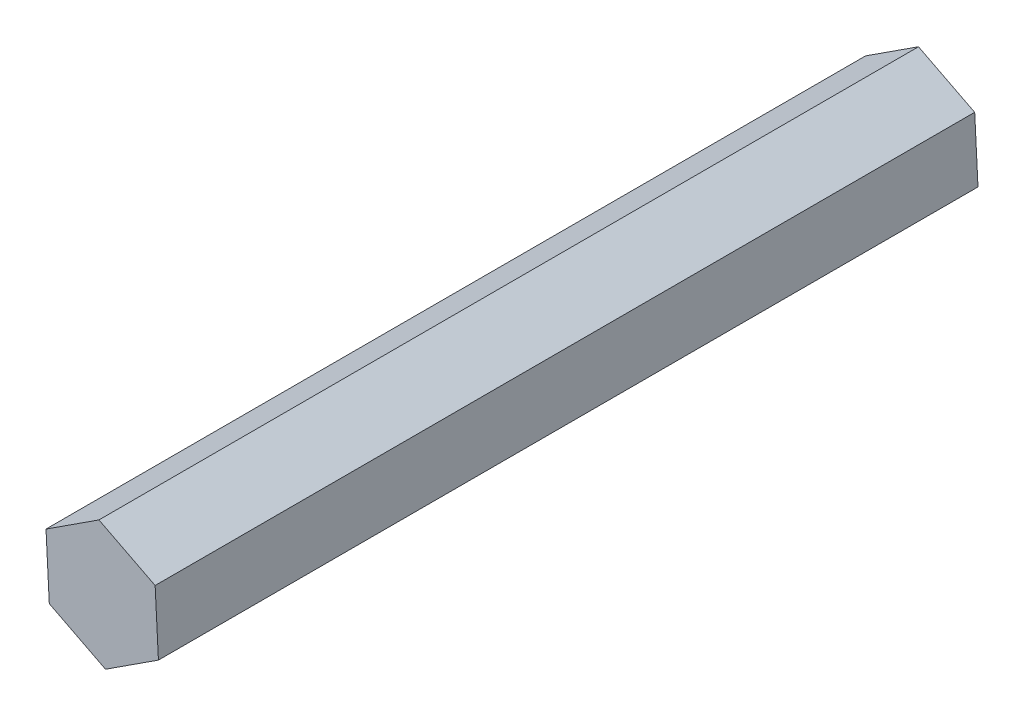
ISO-10303-21;
HEADER;
FILE_DESCRIPTION(('STEP AP214'),'2;1');
FILE_NAME('part.step','',(''),(''),'','','');
FILE_SCHEMA(('AUTOMOTIVE_DESIGN { 1 0 10303 214 1 1 1 1 }'));
ENDSEC;
DATA;
#1=APPLICATION_CONTEXT('core data for automotive mechanical design processes');
#2=APPLICATION_PROTOCOL_DEFINITION('international standard','automotive_design',2000,#1);
#3=PRODUCT_CONTEXT('',#1,'mechanical');
#4=PRODUCT('Part','Part','',(#3));
#5=PRODUCT_RELATED_PRODUCT_CATEGORY('part','',(#4));
#6=PRODUCT_DEFINITION_FORMATION('','',#4);
#7=PRODUCT_DEFINITION_CONTEXT('part definition',#1,'design');
#8=PRODUCT_DEFINITION('design','',#6,#7);
#9=PRODUCT_DEFINITION_SHAPE('','',#8);
#10=(LENGTH_UNIT() NAMED_UNIT(*) SI_UNIT(.MILLI.,.METRE.));
#11=(NAMED_UNIT(*) PLANE_ANGLE_UNIT() SI_UNIT($,.RADIAN.));
#12=(NAMED_UNIT(*) SI_UNIT($,.STERADIAN.) SOLID_ANGLE_UNIT());
#13=UNCERTAINTY_MEASURE_WITH_UNIT(LENGTH_MEASURE(1.E-05),#10,'distance_accuracy_value','');
#14=(GEOMETRIC_REPRESENTATION_CONTEXT(3) GLOBAL_UNCERTAINTY_ASSIGNED_CONTEXT((#13)) GLOBAL_UNIT_ASSIGNED_CONTEXT((#10,
#11,#12)) REPRESENTATION_CONTEXT('',''));
#15=CARTESIAN_POINT('',(0.,0.,0.));
#16=DIRECTION('',(0.,0.,1.));
#17=DIRECTION('',(1.,0.,0.));
#18=AXIS2_PLACEMENT_3D('',#15,#16,#17);
#19=CARTESIAN_POINT('',(-0.383222680415475,7.32232706935087,95.25));
#20=DIRECTION('',(0.544579155708624,-0.838709450982688,0.));
#21=DIRECTION('',(0.838709450982688,0.544579155708624,0.));
#22=AXIS2_PLACEMENT_3D('',#19,#20,#21);
#23=PLANE('',#22);
#24=DIRECTION('',(-0.838709450982688,-0.544579155708624,0.));
#25=VECTOR('',#24,1.);
#26=CARTESIAN_POINT('',(-0.383222680415475,7.32232706935087,0.));
#27=LINE('',#26,#25);
#28=CARTESIAN_POINT('',(-0.383222680415475,7.32232706935087,0.));
#29=VERTEX_POINT('',#28);
#30=CARTESIAN_POINT('',(-6.53293259708405,3.32928295812927,0.));
#31=VERTEX_POINT('',#30);
#32=EDGE_CURVE('E116',#29,#31,#27,.T.);
#33=ORIENTED_EDGE('',*,*,#32,.T.);
#34=DIRECTION('',(0.,0.,-1.));
#35=VECTOR('',#34,1.);
#36=CARTESIAN_POINT('',(-6.53293259708405,3.32928295812927,95.25));
#37=LINE('',#36,#35);
#38=CARTESIAN_POINT('',(-6.53293259708405,3.32928295812927,95.25));
#39=VERTEX_POINT('',#38);
#40=EDGE_CURVE('E11',#39,#31,#37,.T.);
#41=ORIENTED_EDGE('',*,*,#40,.F.);
#42=DIRECTION('',(-0.838709450982688,-0.544579155708624,0.));
#43=VECTOR('',#42,1.);
#44=CARTESIAN_POINT('',(-0.383222680415475,7.32232706935087,95.25));
#45=LINE('',#44,#43);
#46=CARTESIAN_POINT('',(-0.383222680415475,7.32232706935087,95.25));
#47=VERTEX_POINT('',#46);
#48=EDGE_CURVE('E126',#47,#39,#45,.T.);
#49=ORIENTED_EDGE('',*,*,#48,.F.);
#50=DIRECTION('',(0.,0.,-1.));
#51=VECTOR('',#50,1.);
#52=CARTESIAN_POINT('',(-0.383222680415475,7.32232706935087,95.25));
#53=LINE('',#52,#51);
#54=EDGE_CURVE('E112',#47,#29,#53,.T.);
#55=ORIENTED_EDGE('',*,*,#54,.T.);
#56=EDGE_LOOP('',(#33,#41,#49,#55));
#57=FACE_BOUND('',#56,.T.);
#58=ADVANCED_FACE('F32',(#57),#23,.F.);
#59=CARTESIAN_POINT('',(-6.53293259708405,3.32928295812927,95.25));
#60=DIRECTION('',(0.998633268799419,0.0522646577238061,0.));
#61=DIRECTION('',(-0.0522646577238061,0.998633268799419,0.));
#62=AXIS2_PLACEMENT_3D('',#59,#60,#61);
#63=PLANE('',#62);
#64=DIRECTION('',(0.0522646577238061,-0.998633268799419,0.));
#65=VECTOR('',#64,1.);
#66=CARTESIAN_POINT('',(-6.53293259708405,3.32928295812927,0.));
#67=LINE('',#66,#65);
#68=CARTESIAN_POINT('',(-6.14970991666858,-3.9930441112216,0.));
#69=VERTEX_POINT('',#68);
#70=EDGE_CURVE('E119',#31,#69,#67,.T.);
#71=ORIENTED_EDGE('',*,*,#70,.T.);
#72=DIRECTION('',(0.,0.,-1.));
#73=VECTOR('',#72,1.);
#74=CARTESIAN_POINT('',(-6.14970991666858,-3.9930441112216,95.25));
#75=LINE('',#74,#73);
#76=CARTESIAN_POINT('',(-6.14970991666858,-3.9930441112216,95.25));
#77=VERTEX_POINT('',#76);
#78=EDGE_CURVE('E40',#77,#69,#75,.T.);
#79=ORIENTED_EDGE('',*,*,#78,.F.);
#80=DIRECTION('',(0.0522646577238061,-0.998633268799419,0.));
#81=VECTOR('',#80,1.);
#82=CARTESIAN_POINT('',(-6.53293259708405,3.32928295812927,95.25));
#83=LINE('',#82,#81);
#84=EDGE_CURVE('E85',#39,#77,#83,.T.);
#85=ORIENTED_EDGE('',*,*,#84,.F.);
#86=ORIENTED_EDGE('',*,*,#40,.T.);
#87=EDGE_LOOP('',(#71,#79,#85,#86));
#88=FACE_BOUND('',#87,.T.);
#89=ADVANCED_FACE('F150',(#88),#63,.F.);
#90=CARTESIAN_POINT('',(-6.14970991666858,-3.9930441112216,95.25));
#91=DIRECTION('',(0.454054113090795,0.890974108706494,0.));
#92=DIRECTION('',(-0.890974108706494,0.454054113090795,0.));
#93=AXIS2_PLACEMENT_3D('',#90,#91,#92);
#94=PLANE('',#93);
#95=DIRECTION('',(0.890974108706494,-0.454054113090795,0.));
#96=VECTOR('',#95,1.);
#97=CARTESIAN_POINT('',(-6.14970991666858,-3.9930441112216,0.));
#98=LINE('',#97,#96);
#99=CARTESIAN_POINT('',(0.383222680415474,-7.32232706935087,0.));
#100=VERTEX_POINT('',#99);
#101=EDGE_CURVE('E121',#69,#100,#98,.T.);
#102=ORIENTED_EDGE('',*,*,#101,.T.);
#103=DIRECTION('',(0.,0.,-1.));
#104=VECTOR('',#103,1.);
#105=CARTESIAN_POINT('',(0.383222680415474,-7.32232706935087,95.25));
#106=LINE('',#105,#104);
#107=CARTESIAN_POINT('',(0.383222680415474,-7.32232706935087,95.25));
#108=VERTEX_POINT('',#107);
#109=EDGE_CURVE('E107',#108,#100,#106,.T.);
#110=ORIENTED_EDGE('',*,*,#109,.F.);
#111=DIRECTION('',(0.890974108706494,-0.454054113090795,0.));
#112=VECTOR('',#111,1.);
#113=CARTESIAN_POINT('',(-6.14970991666858,-3.9930441112216,95.25));
#114=LINE('',#113,#112);
#115=EDGE_CURVE('E98',#77,#108,#114,.T.);
#116=ORIENTED_EDGE('',*,*,#115,.F.);
#117=ORIENTED_EDGE('',*,*,#78,.T.);
#118=EDGE_LOOP('',(#102,#110,#116,#117));
#119=FACE_BOUND('',#118,.T.);
#120=ADVANCED_FACE('F132',(#119),#94,.F.);
#121=CARTESIAN_POINT('',(0.383222680415474,-7.32232706935087,95.25));
#122=DIRECTION('',(-0.544579155708624,0.838709450982688,0.));
#123=DIRECTION('',(-0.838709450982688,-0.544579155708624,0.));
#124=AXIS2_PLACEMENT_3D('',#121,#122,#123);
#125=PLANE('',#124);
#126=DIRECTION('',(0.838709450982688,0.544579155708624,0.));
#127=VECTOR('',#126,1.);
#128=CARTESIAN_POINT('',(0.383222680415474,-7.32232706935087,0.));
#129=LINE('',#128,#127);
#130=CARTESIAN_POINT('',(6.53293259708405,-3.32928295812927,0.));
#131=VERTEX_POINT('',#130);
#132=EDGE_CURVE('E106',#100,#131,#129,.T.);
#133=ORIENTED_EDGE('',*,*,#132,.T.);
#134=DIRECTION('',(0.,0.,-1.));
#135=VECTOR('',#134,1.);
#136=CARTESIAN_POINT('',(6.53293259708405,-3.32928295812927,95.25));
#137=LINE('',#136,#135);
#138=CARTESIAN_POINT('',(6.53293259708405,-3.32928295812927,95.25));
#139=VERTEX_POINT('',#138);
#140=EDGE_CURVE('E103',#139,#131,#137,.T.);
#141=ORIENTED_EDGE('',*,*,#140,.F.);
#142=DIRECTION('',(0.838709450982688,0.544579155708624,0.));
#143=VECTOR('',#142,1.);
#144=CARTESIAN_POINT('',(0.383222680415474,-7.32232706935087,95.25));
#145=LINE('',#144,#143);
#146=EDGE_CURVE('E92',#108,#139,#145,.T.);
#147=ORIENTED_EDGE('',*,*,#146,.F.);
#148=ORIENTED_EDGE('',*,*,#109,.T.);
#149=EDGE_LOOP('',(#133,#141,#147,#148));
#150=FACE_BOUND('',#149,.T.);
#151=ADVANCED_FACE('F104',(#150),#125,.F.);
#152=CARTESIAN_POINT('',(6.53293259708405,-3.32928295812927,95.25));
#153=DIRECTION('',(-0.998633268799419,-0.0522646577238062,0.));
#154=DIRECTION('',(0.0522646577238062,-0.998633268799419,0.));
#155=AXIS2_PLACEMENT_3D('',#152,#153,#154);
#156=PLANE('',#155);
#157=DIRECTION('',(-0.0522646577238062,0.998633268799419,0.));
#158=VECTOR('',#157,1.);
#159=CARTESIAN_POINT('',(6.53293259708405,-3.32928295812927,0.));
#160=LINE('',#159,#158);
#161=CARTESIAN_POINT('',(6.14970991666857,3.99304411122161,0.));
#162=VERTEX_POINT('',#161);
#163=EDGE_CURVE('E71',#131,#162,#160,.T.);
#164=ORIENTED_EDGE('',*,*,#163,.T.);
#165=DIRECTION('',(0.,0.,-1.));
#166=VECTOR('',#165,1.);
#167=CARTESIAN_POINT('',(6.14970991666857,3.99304411122161,95.25));
#168=LINE('',#167,#166);
#169=CARTESIAN_POINT('',(6.14970991666857,3.99304411122161,95.25));
#170=VERTEX_POINT('',#169);
#171=EDGE_CURVE('E108',#170,#162,#168,.T.);
#172=ORIENTED_EDGE('',*,*,#171,.F.);
#173=DIRECTION('',(-0.0522646577238062,0.998633268799419,0.));
#174=VECTOR('',#173,1.);
#175=CARTESIAN_POINT('',(6.53293259708405,-3.32928295812927,95.25));
#176=LINE('',#175,#174);
#177=EDGE_CURVE('E96',#139,#170,#176,.T.);
#178=ORIENTED_EDGE('',*,*,#177,.F.);
#179=ORIENTED_EDGE('',*,*,#140,.T.);
#180=EDGE_LOOP('',(#164,#172,#178,#179));
#181=FACE_BOUND('',#180,.T.);
#182=ADVANCED_FACE('F110',(#181),#156,.F.);
#183=CARTESIAN_POINT('',(6.14970991666857,3.99304411122161,95.25));
#184=DIRECTION('',(-0.454054113090795,-0.890974108706494,0.));
#185=DIRECTION('',(0.890974108706494,-0.454054113090795,0.));
#186=AXIS2_PLACEMENT_3D('',#183,#184,#185);
#187=PLANE('',#186);
#188=DIRECTION('',(-0.890974108706494,0.454054113090795,0.));
#189=VECTOR('',#188,1.);
#190=CARTESIAN_POINT('',(6.14970991666857,3.99304411122161,0.));
#191=LINE('',#190,#189);
#192=EDGE_CURVE('E77',#162,#29,#191,.T.);
#193=ORIENTED_EDGE('',*,*,#192,.T.);
#194=ORIENTED_EDGE('',*,*,#54,.F.);
#195=DIRECTION('',(-0.890974108706494,0.454054113090795,0.));
#196=VECTOR('',#195,1.);
#197=CARTESIAN_POINT('',(6.14970991666857,3.99304411122161,95.25));
#198=LINE('',#197,#196);
#199=EDGE_CURVE('E48',#170,#47,#198,.T.);
#200=ORIENTED_EDGE('',*,*,#199,.F.);
#201=ORIENTED_EDGE('',*,*,#171,.T.);
#202=EDGE_LOOP('',(#193,#194,#200,#201));
#203=FACE_BOUND('',#202,.T.);
#204=ADVANCED_FACE('F139',(#203),#187,.F.);
#205=CARTESIAN_POINT('',(0.,0.,95.25));
#206=DIRECTION('',(0.,0.,1.));
#207=DIRECTION('',(1.,0.,0.));
#208=AXIS2_PLACEMENT_3D('',#205,#206,#207);
#209=PLANE('',#208);
#210=ORIENTED_EDGE('',*,*,#48,.T.);
#211=ORIENTED_EDGE('',*,*,#84,.T.);
#212=ORIENTED_EDGE('',*,*,#115,.T.);
#213=ORIENTED_EDGE('',*,*,#146,.T.);
#214=ORIENTED_EDGE('',*,*,#177,.T.);
#215=ORIENTED_EDGE('',*,*,#199,.T.);
#216=EDGE_LOOP('',(#210,#211,#212,#213,#214,#215));
#217=FACE_BOUND('',#216,.T.);
#218=ADVANCED_FACE('F94',(#217),#209,.T.);
#219=CARTESIAN_POINT('',(0.,0.,0.));
#220=DIRECTION('',(0.,0.,1.));
#221=DIRECTION('',(1.,0.,0.));
#222=AXIS2_PLACEMENT_3D('',#219,#220,#221);
#223=PLANE('',#222);
#224=ORIENTED_EDGE('',*,*,#32,.F.);
#225=ORIENTED_EDGE('',*,*,#192,.F.);
#226=ORIENTED_EDGE('',*,*,#163,.F.);
#227=ORIENTED_EDGE('',*,*,#132,.F.);
#228=ORIENTED_EDGE('',*,*,#101,.F.);
#229=ORIENTED_EDGE('',*,*,#70,.F.);
#230=EDGE_LOOP('',(#224,#225,#226,#227,#228,#229));
#231=FACE_BOUND('',#230,.T.);
#232=ADVANCED_FACE('F135',(#231),#223,.F.);
#233=CLOSED_SHELL('',(#58,#89,#120,#151,#182,#204,#218,#232));
#234=MANIFOLD_SOLID_BREP('B2',#233);
#235=ADVANCED_BREP_SHAPE_REPRESENTATION('',(#18,#234),#14);
#236=SHAPE_DEFINITION_REPRESENTATION(#9,#235);
ENDSEC;
END-ISO-10303-21;
